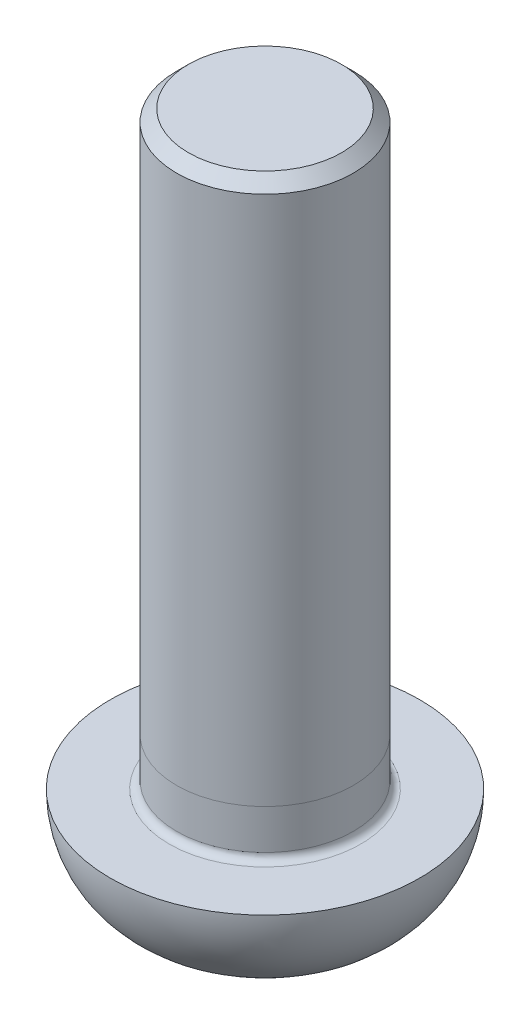
ISO-10303-21;
HEADER;
FILE_DESCRIPTION(('STEP AP214'),'2;1');
FILE_NAME('part.step','',(''),(''),'','','');
FILE_SCHEMA(('AUTOMOTIVE_DESIGN { 1 0 10303 214 1 1 1 1 }'));
ENDSEC;
DATA;
#1=APPLICATION_CONTEXT('core data for automotive mechanical design processes');
#2=APPLICATION_PROTOCOL_DEFINITION('international standard','automotive_design',2000,#1);
#3=PRODUCT_CONTEXT('',#1,'mechanical');
#4=PRODUCT('Part','Part','',(#3));
#5=PRODUCT_RELATED_PRODUCT_CATEGORY('part','',(#4));
#6=PRODUCT_DEFINITION_FORMATION('','',#4);
#7=PRODUCT_DEFINITION_CONTEXT('part definition',#1,'design');
#8=PRODUCT_DEFINITION('design','',#6,#7);
#9=PRODUCT_DEFINITION_SHAPE('','',#8);
#10=(LENGTH_UNIT() NAMED_UNIT(*) SI_UNIT(.MILLI.,.METRE.));
#11=(NAMED_UNIT(*) PLANE_ANGLE_UNIT() SI_UNIT($,.RADIAN.));
#12=(NAMED_UNIT(*) SI_UNIT($,.STERADIAN.) SOLID_ANGLE_UNIT());
#13=UNCERTAINTY_MEASURE_WITH_UNIT(LENGTH_MEASURE(1.E-05),#10,'distance_accuracy_value','');
#14=(GEOMETRIC_REPRESENTATION_CONTEXT(3) GLOBAL_UNCERTAINTY_ASSIGNED_CONTEXT((#13)) GLOBAL_UNIT_ASSIGNED_CONTEXT((#10,
#11,#12)) REPRESENTATION_CONTEXT('',''));
#15=CARTESIAN_POINT('',(0.,0.,0.));
#16=DIRECTION('',(0.,0.,1.));
#17=DIRECTION('',(1.,0.,0.));
#18=AXIS2_PLACEMENT_3D('',#15,#16,#17);
#19=CARTESIAN_POINT('',(0.,0.,0.));
#20=DIRECTION('',(0.,1.,0.));
#21=DIRECTION('',(0.,0.,1.));
#22=AXIS2_PLACEMENT_3D('',#19,#20,#21);
#23=CYLINDRICAL_SURFACE('',#22,3.);
#24=CARTESIAN_POINT('',(0.,19.6,0.));
#25=DIRECTION('',(0.,1.,0.));
#26=DIRECTION('',(0.,0.,1.));
#27=AXIS2_PLACEMENT_3D('',#24,#25,#26);
#28=CIRCLE('',#27,3.);
#29=CARTESIAN_POINT('',(0.,19.6,3.));
#30=VERTEX_POINT('',#29);
#31=EDGE_CURVE('E28',#30,#30,#28,.F.);
#32=ORIENTED_EDGE('',*,*,#31,.T.);
#33=EDGE_LOOP('',(#32));
#34=FACE_BOUND('',#33,.T.);
#35=CARTESIAN_POINT('',(0.,1.6,0.));
#36=DIRECTION('',(0.,1.,0.));
#37=DIRECTION('',(0.,0.,1.));
#38=AXIS2_PLACEMENT_3D('',#35,#36,#37);
#39=CIRCLE('',#38,3.);
#40=CARTESIAN_POINT('',(0.,1.6,3.));
#41=VERTEX_POINT('',#40);
#42=EDGE_CURVE('E11',#41,#41,#39,.T.);
#43=ORIENTED_EDGE('',*,*,#42,.T.);
#44=EDGE_LOOP('',(#43));
#45=FACE_BOUND('',#44,.T.);
#46=ADVANCED_FACE('F18',(#34,#45),#23,.T.);
#47=ORIENTED_EDGE('',*,*,#42,.F.);
#48=EDGE_LOOP('',(#47));
#49=FACE_BOUND('',#48,.T.);
#50=CARTESIAN_POINT('',(0.,0.25,0.));
#51=DIRECTION('',(0.,1.,0.));
#52=DIRECTION('',(0.,0.,1.));
#53=AXIS2_PLACEMENT_3D('',#50,#51,#52);
#54=CIRCLE('',#53,3.);
#55=CARTESIAN_POINT('',(0.,0.25,3.));
#56=VERTEX_POINT('',#55);
#57=EDGE_CURVE('E280',#56,#56,#54,.T.);
#58=ORIENTED_EDGE('',*,*,#57,.T.);
#59=EDGE_LOOP('',(#58));
#60=FACE_BOUND('',#59,.T.);
#61=ADVANCED_FACE('F192',(#49,#60),#23,.T.);
#62=CARTESIAN_POINT('',(5.25,0.,0.));
#63=DIRECTION('',(0.,1.,0.));
#64=DIRECTION('',(0.,0.,1.));
#65=AXIS2_PLACEMENT_3D('',#62,#63,#64);
#66=PLANE('',#65);
#67=CARTESIAN_POINT('',(0.,0.,0.));
#68=DIRECTION('',(0.,1.,0.));
#69=DIRECTION('',(0.,0.,1.));
#70=AXIS2_PLACEMENT_3D('',#67,#68,#69);
#71=CIRCLE('',#70,3.25);
#72=CARTESIAN_POINT('',(0.,0.,3.25));
#73=VERTEX_POINT('',#72);
#74=EDGE_CURVE('E277',#73,#73,#71,.F.);
#75=ORIENTED_EDGE('',*,*,#74,.T.);
#76=EDGE_LOOP('',(#75));
#77=FACE_BOUND('',#76,.T.);
#78=CARTESIAN_POINT('',(0.,0.,0.));
#79=DIRECTION('',(0.,1.,0.));
#80=DIRECTION('',(0.,0.,1.));
#81=AXIS2_PLACEMENT_3D('',#78,#79,#80);
#82=CIRCLE('',#81,5.25);
#83=CARTESIAN_POINT('',(0.,0.,5.25));
#84=VERTEX_POINT('',#83);
#85=EDGE_CURVE('E108',#84,#84,#82,.T.);
#86=ORIENTED_EDGE('',*,*,#85,.T.);
#87=EDGE_LOOP('',(#86));
#88=FACE_BOUND('',#87,.T.);
#89=ADVANCED_FACE('F199',(#77,#88),#66,.T.);
#90=CARTESIAN_POINT('',(0.,20.,0.));
#91=DIRECTION('',(0.,1.,0.));
#92=DIRECTION('',(0.,0.,1.));
#93=AXIS2_PLACEMENT_3D('',#90,#91,#92);
#94=PLANE('',#93);
#95=CARTESIAN_POINT('',(0.,20.,0.));
#96=DIRECTION('',(0.,1.,0.));
#97=DIRECTION('',(0.,0.,1.));
#98=AXIS2_PLACEMENT_3D('',#95,#96,#97);
#99=CIRCLE('',#98,2.6);
#100=CARTESIAN_POINT('',(0.,20.,2.6));
#101=VERTEX_POINT('',#100);
#102=EDGE_CURVE('E282',#101,#101,#99,.T.);
#103=ORIENTED_EDGE('',*,*,#102,.T.);
#104=EDGE_LOOP('',(#103));
#105=FACE_BOUND('',#104,.T.);
#106=ADVANCED_FACE('F227',(#105),#94,.T.);
#107=CARTESIAN_POINT('',(0.,0.25,0.));
#108=DIRECTION('',(0.,1.,0.));
#109=DIRECTION('',(0.,0.,1.));
#110=AXIS2_PLACEMENT_3D('',#107,#108,#109);
#111=TOROIDAL_SURFACE('',#110,3.25,0.25);
#112=ORIENTED_EDGE('',*,*,#74,.F.);
#113=EDGE_LOOP('',(#112));
#114=FACE_BOUND('',#113,.T.);
#115=ORIENTED_EDGE('',*,*,#57,.F.);
#116=EDGE_LOOP('',(#115));
#117=FACE_BOUND('',#116,.T.);
#118=ADVANCED_FACE('F265',(#114,#117),#111,.F.);
#119=CARTESIAN_POINT('',(0.,20.,0.));
#120=DIRECTION('',(0.,-1.,0.));
#121=DIRECTION('',(0.,0.,-1.));
#122=AXIS2_PLACEMENT_3D('',#119,#120,#121);
#123=CONICAL_SURFACE('',#122,2.6,0.785398163397448);
#124=ORIENTED_EDGE('',*,*,#31,.F.);
#125=EDGE_LOOP('',(#124));
#126=FACE_BOUND('',#125,.T.);
#127=ORIENTED_EDGE('',*,*,#102,.F.);
#128=EDGE_LOOP('',(#127));
#129=FACE_BOUND('',#128,.T.);
#130=ADVANCED_FACE('F21',(#126,#129),#123,.T.);
#131=CARTESIAN_POINT('',(0.,0.,0.));
#132=DIRECTION('',(0.,-1.,0.));
#133=DIRECTION('',(0.,0.,-1.));
#134=AXIS2_PLACEMENT_3D('',#131,#132,#133);
#135=DEGENERATE_TOROIDAL_SURFACE('',#134,1.67165208586472,3.57834791413527,.T.);
#136=ORIENTED_EDGE('',*,*,#85,.F.);
#137=EDGE_LOOP('',(#136));
#138=FACE_BOUND('',#137,.T.);
#139=CARTESIAN_POINT('',(0.,-3.3,0.));
#140=DIRECTION('',(0.,-1.,0.));
#141=DIRECTION('',(0.,0.,-1.));
#142=AXIS2_PLACEMENT_3D('',#139,#140,#141);
#143=CIRCLE('',#142,3.05533333333333);
#144=CARTESIAN_POINT('',(0.,-3.3,-3.05533333333333));
#145=VERTEX_POINT('',#144);
#146=EDGE_CURVE('E119',#145,#145,#143,.T.);
#147=ORIENTED_EDGE('',*,*,#146,.F.);
#148=EDGE_LOOP('',(#147));
#149=FACE_BOUND('',#148,.T.);
#150=ADVANCED_FACE('F143',(#138,#149),#135,.T.);
#151=CARTESIAN_POINT('',(0.,0.391673276442843,0.));
#152=DIRECTION('',(0.,-1.,0.));
#153=DIRECTION('',(0.,0.,-1.));
#154=AXIS2_PLACEMENT_3D('',#151,#152,#153);
#155=CONICAL_SURFACE('',#154,0.,1.0471975511966);
#156=CARTESIAN_POINT('',(0.,0.391673276442843,0.));
#157=VERTEX_POINT('',#156);
#158=VERTEX_LOOP('',#157);
#159=FACE_BOUND('',#158,.T.);
#160=CARTESIAN_POINT('',(-1.15458506832542,-0.94172672855691,2.0002));
#161=CARTESIAN_POINT('',(-1.20532911262018,-0.91241679803709,1.91230873709994));
#162=CARTESIAN_POINT('',(-1.2565111744778,-0.885760113916877,1.82365880552641));
#163=CARTESIAN_POINT('',(-1.3597616401932,-0.839229752957131,1.6448237530022));
#164=CARTESIAN_POINT('',(-1.41183187919145,-0.81937253831919,1.55463545349496));
#165=CARTESIAN_POINT('',(-1.51532701829184,-0.788460725959663,1.37537661423669));
#166=CARTESIAN_POINT('',(-1.56673599086579,-0.777200413534941,1.28633366177369));
#167=CARTESIAN_POINT('',(-1.66979593505374,-0.763755924531052,1.10782860221495));
#168=CARTESIAN_POINT('',(-1.72144653186531,-0.76156061688988,1.01836714429604));
#169=CARTESIAN_POINT('',(-1.81796535054794,-0.766118251267061,0.851191646451197));
#170=CARTESIAN_POINT('',(-1.86284799277603,-0.771752136623426,0.773452629734213));
#171=CARTESIAN_POINT('',(-1.95232085557725,-0.789611157197239,0.618481085463865));
#172=CARTESIAN_POINT('',(-1.99691076648955,-0.80184239795985,0.5412490942588));
#173=CARTESIAN_POINT('',(-2.08656822922817,-0.832420698804021,0.385957813517798));
#174=CARTESIAN_POINT('',(-2.13162442866767,-0.850897429002127,0.30791818689262));
#175=CARTESIAN_POINT('',(-2.221064675979,-0.892832780149267,0.153003134307866));
#176=CARTESIAN_POINT('',(-2.26544987045196,-0.916281542428724,0.0761257223768807));
#177=CARTESIAN_POINT('',(-2.30951654681234,-0.941726728556909,-0.000200000000000072));
#178=B_SPLINE_CURVE_WITH_KNOTS('',3,(#160,#161,#162,#163,#164,#165,#166,#167,#168,#169,#170,
#171,#172,#173,#174,#175,#176,#177),.UNSPECIFIED.,.F.,.F.,(4,2,2,2,2,2,2,2,4),(0.,
0.317031824695611,0.634825876346566,0.944753967652639,1.25430138000372,1.52387047293094,
1.79368946861028,2.06949491027634,2.34475850821472),.UNSPECIFIED.);
#179=CARTESIAN_POINT('',(-1.15470053837926,-0.941660056890493,2.));
#180=VERTEX_POINT('',#179);
#181=CARTESIAN_POINT('',(-2.3094010767585,-0.941660056890492,0.));
#182=VERTEX_POINT('',#181);
#183=EDGE_CURVE('E231',#180,#182,#178,.T.);
#184=ORIENTED_EDGE('',*,*,#183,.T.);
#185=CARTESIAN_POINT('',(-2.30951654681234,-0.941726728556909,0.000200000000000068));
#186=CARTESIAN_POINT('',(-2.25877250251757,-0.912416798037088,-0.0876912629000591));
#187=CARTESIAN_POINT('',(-2.20759044065995,-0.885760113916875,-0.17634119447359));
#188=CARTESIAN_POINT('',(-2.10433997494456,-0.839229752957128,-0.3551762469978));
#189=CARTESIAN_POINT('',(-2.0522697359463,-0.819372538319187,-0.445364546505035));
#190=CARTESIAN_POINT('',(-1.94877459684592,-0.78846072595966,-0.624623385763304));
#191=CARTESIAN_POINT('',(-1.89736562427197,-0.777200413534938,-0.713666338226302));
#192=CARTESIAN_POINT('',(-1.79430568008402,-0.76375592453105,-0.892171397785041));
#193=CARTESIAN_POINT('',(-1.74265508327244,-0.761560616889878,-0.981632855703956));
#194=CARTESIAN_POINT('',(-1.64613626458981,-0.766118251267059,-1.1488083535488));
#195=CARTESIAN_POINT('',(-1.60125362236172,-0.771752136623423,-1.22654737026578));
#196=CARTESIAN_POINT('',(-1.5117807595605,-0.789611157197235,-1.38151891453613));
#197=CARTESIAN_POINT('',(-1.46719084864821,-0.801842397959847,-1.4587509057412));
#198=CARTESIAN_POINT('',(-1.37753338590959,-0.832420698804018,-1.6140421864822));
#199=CARTESIAN_POINT('',(-1.33247718647008,-0.850897429002124,-1.69208181310738));
#200=CARTESIAN_POINT('',(-1.24303693915875,-0.892832780149265,-1.84699686569214));
#201=CARTESIAN_POINT('',(-1.19865174468579,-0.916281542428723,-1.92387427762312));
#202=CARTESIAN_POINT('',(-1.15458506832541,-0.94172672855691,-2.0002));
#203=B_SPLINE_CURVE_WITH_KNOTS('',3,(#185,#186,#187,#188,#189,#190,#191,#192,#193,#194,#195,
#196,#197,#198,#199,#200,#201,#202),.UNSPECIFIED.,.F.,.F.,(4,2,2,2,2,2,2,2,4),(0.,
0.31703182469561,0.634825876346564,0.944753967652636,1.25430138000371,1.52387047293094,
1.79368946861028,2.06949491027634,2.34475850821473),.UNSPECIFIED.);
#204=CARTESIAN_POINT('',(-1.15470053837925,-0.941660056890493,-2.));
#205=VERTEX_POINT('',#204);
#206=EDGE_CURVE('E210',#182,#205,#203,.T.);
#207=ORIENTED_EDGE('',*,*,#206,.T.);
#208=CARTESIAN_POINT('',(-3.97107242292986,-2.17538835040825,-2.));
#209=CARTESIAN_POINT('',(-3.87868247277526,-2.12775059746127,-2.));
#210=CARTESIAN_POINT('',(-3.7861588003778,-2.08037372958414,-2.));
#211=CARTESIAN_POINT('',(-3.60078450821548,-1.98626017948102,-2.00000000000001));
#212=CARTESIAN_POINT('',(-3.50793388259158,-1.93952350880157,-2.00000000000001));
#213=CARTESIAN_POINT('',(-3.22850900761148,-1.80030535880982,-2.));
#214=CARTESIAN_POINT('',(-3.04135761037277,-1.70896924768975,-2.));
#215=CARTESIAN_POINT('',(-2.75397555619272,-1.5731154540905,-2.));
#216=CARTESIAN_POINT('',(-2.65454530475032,-1.52690595800733,-2.));
#217=CARTESIAN_POINT('',(-2.45492785759602,-1.43615536855376,-2.));
#218=CARTESIAN_POINT('',(-2.3547406899451,-1.39161421369455,-2.));
#219=CARTESIAN_POINT('',(-2.15350213975009,-1.30470652650298,-2.));
#220=CARTESIAN_POINT('',(-2.05245137959688,-1.26233856057289,-2.));
#221=CARTESIAN_POINT('',(-1.84919030086332,-1.18039650371769,-2.));
#222=CARTESIAN_POINT('',(-1.74697972173689,-1.14082305558609,-2.));
#223=CARTESIAN_POINT('',(-1.52508206994959,-1.05946514421621,-2.));
#224=CARTESIAN_POINT('',(-1.40516322629618,-1.01830385306277,-2.));
#225=CARTESIAN_POINT('',(-1.16321218809007,-0.942832074454553,-2.));
#226=CARTESIAN_POINT('',(-1.04118108489843,-0.908518157540933,-2.));
#227=CARTESIAN_POINT('',(-0.797191699347654,-0.849762632395411,-2.));
#228=CARTESIAN_POINT('',(-0.675277439673617,-0.825143320410585,-2.));
#229=CARTESIAN_POINT('',(-0.42968597996561,-0.78740551194056,-2.));
#230=CARTESIAN_POINT('',(-0.306009864773069,-0.774280224898857,-2.));
#231=CARTESIAN_POINT('',(-0.0561948130021474,-0.761222818220792,-2.));
#232=CARTESIAN_POINT('',(0.0699543957642671,-0.761477523372083,-2.));
#233=CARTESIAN_POINT('',(0.321490472578919,-0.775609005131668,-2.));
#234=CARTESIAN_POINT('',(0.446877078128915,-0.789490231676833,-2.));
#235=CARTESIAN_POINT('',(0.698268076239721,-0.829339251040338,-2.));
#236=CARTESIAN_POINT('',(0.824232704616094,-0.855548309192251,-1.99999999999999));
#237=CARTESIAN_POINT('',(1.07382197335698,-0.917314019236256,-2.));
#238=CARTESIAN_POINT('',(1.19744582529425,-0.952873762658447,-2.));
#239=CARTESIAN_POINT('',(1.43877717975325,-1.02962266424125,-2.));
#240=CARTESIAN_POINT('',(1.55655051066925,-1.07060890554915,-2.));
#241=CARTESIAN_POINT('',(1.79038315988528,-1.15724391469459,-1.99999999999999));
#242=CARTESIAN_POINT('',(1.90644203337208,-1.20289386902531,-1.99999999999999));
#243=CARTESIAN_POINT('',(2.13727613898438,-1.29764227315016,-1.99999999999999));
#244=CARTESIAN_POINT('',(2.25204987258198,-1.3467443434052,-1.99999999999999));
#245=CARTESIAN_POINT('',(2.48048565996255,-1.44747310577301,-1.99999999999999));
#246=CARTESIAN_POINT('',(2.59414765093807,-1.499099939544,-1.99999999999999));
#247=CARTESIAN_POINT('',(2.81406706680889,-1.60122748447267,-1.99999999999999));
#248=CARTESIAN_POINT('',(2.92037405177845,-1.65162191070667,-1.99999999999999));
#249=CARTESIAN_POINT('',(3.1323563665145,-1.75372845058398,-1.99999999999999));
#250=CARTESIAN_POINT('',(3.23803167473215,-1.80544060886685,-1.99999999999999));
#251=CARTESIAN_POINT('',(3.44851064882037,-1.90972549113419,-1.99999999999999));
#252=CARTESIAN_POINT('',(3.55331605390046,-1.96229471304186,-1.99999999999999));
#253=CARTESIAN_POINT('',(3.7624942913087,-2.06826501338616,-1.99999999999999));
#254=CARTESIAN_POINT('',(3.86686716058578,-2.12166601883339,-1.99999999999999));
#255=CARTESIAN_POINT('',(3.97107242292986,-2.17538835040825,-2.));
#256=B_SPLINE_CURVE_WITH_KNOTS('',3,(#208,#209,#210,#211,#212,#213,#214,#215,#216,#217,#218,
#219,#220,#221,#222,#223,#224,#225,#226,#227,#228,#229,#230,#231,#232,#233,#234,#235,#236,#237,
#238,#239,#240,#241,#242,#243,#244,#245,#246,#247,#248,#249,#250,#251,#252,#253,#254,#255),
.UNSPECIFIED.,.F.,.F.,(4,2,2,2,2,2,2,2,2,2,2,2,2,2,2,2,2,2,2,2,2,2,2,4),(0.,0.311842723826934,
0.62369106463389,1.24838758455579,1.57730682351192,1.90621392778465,2.23490119378745,
2.56366381964157,2.94387628317646,3.32389783939494,3.69658721194995,4.06905625447051,
4.44672744508521,4.82452201071132,5.21003920255201,5.59568401496473,5.96965872681082,
6.34372881945369,6.71819725104189,7.09268671728378,7.44561614609446,7.79855754669429,
8.15030525169476,8.50202226264185),.UNSPECIFIED.);
#257=CARTESIAN_POINT('',(1.15470053837925,-0.941660056890493,-2.));
#258=VERTEX_POINT('',#257);
#259=EDGE_CURVE('E106',#205,#258,#256,.T.);
#260=ORIENTED_EDGE('',*,*,#259,.T.);
#261=CARTESIAN_POINT('',(1.15458506832542,-0.941726728556909,-2.0002));
#262=CARTESIAN_POINT('',(1.20532911262018,-0.912416798037089,-1.91230873709994));
#263=CARTESIAN_POINT('',(1.2565111744778,-0.885760113916877,-1.82365880552641));
#264=CARTESIAN_POINT('',(1.3597616401932,-0.839229752957131,-1.6448237530022));
#265=CARTESIAN_POINT('',(1.41183187919145,-0.819372538319189,-1.55463545349496));
#266=CARTESIAN_POINT('',(1.51532701829183,-0.788460725959662,-1.37537661423669));
#267=CARTESIAN_POINT('',(1.56673599086579,-0.777200413534941,-1.2863336617737));
#268=CARTESIAN_POINT('',(1.66979593505373,-0.763755924531052,-1.10782860221496));
#269=CARTESIAN_POINT('',(1.72144653186531,-0.761560616889879,-1.01836714429604));
#270=CARTESIAN_POINT('',(1.81796535054794,-0.76611825126706,-0.851191646451198));
#271=CARTESIAN_POINT('',(1.86284799277603,-0.771752136623425,-0.773452629734214));
#272=CARTESIAN_POINT('',(1.95232085557725,-0.789611157197238,-0.618481085463866));
#273=CARTESIAN_POINT('',(1.99691076648955,-0.801842397959849,-0.5412490942588));
#274=CARTESIAN_POINT('',(2.08656822922816,-0.83242069880402,-0.385957813517797));
#275=CARTESIAN_POINT('',(2.13162442866767,-0.850897429002126,-0.307918186892618));
#276=CARTESIAN_POINT('',(2.221064675979,-0.892832780149267,-0.153003134307863));
#277=CARTESIAN_POINT('',(2.26544987045196,-0.916281542428724,-0.0761257223768773));
#278=CARTESIAN_POINT('',(2.30951654681234,-0.941726728556909,0.000200000000003827));
#279=B_SPLINE_CURVE_WITH_KNOTS('',3,(#261,#262,#263,#264,#265,#266,#267,#268,#269,#270,#271,
#272,#273,#274,#275,#276,#277,#278),.UNSPECIFIED.,.F.,.F.,(4,2,2,2,2,2,2,2,4),(0.,
0.317031824695611,0.634825876346564,0.944753967652637,1.25430138000371,1.52387047293094,
1.79368946861028,2.06949491027634,2.34475850821473),.UNSPECIFIED.);
#280=CARTESIAN_POINT('',(2.3094010767585,-0.941660056890493,0.));
#281=VERTEX_POINT('',#280);
#282=EDGE_CURVE('E255',#258,#281,#279,.T.);
#283=ORIENTED_EDGE('',*,*,#282,.T.);
#284=CARTESIAN_POINT('',(2.30951654681234,-0.941726728556909,-0.000199999999996057));
#285=CARTESIAN_POINT('',(2.25877250251757,-0.912416798037088,0.0876912629000633));
#286=CARTESIAN_POINT('',(2.20759044065995,-0.885760113916875,0.176341194473594));
#287=CARTESIAN_POINT('',(2.10433997494456,-0.839229752957129,0.355176246997805));
#288=CARTESIAN_POINT('',(2.0522697359463,-0.819372538319187,0.445364546505039));
#289=CARTESIAN_POINT('',(1.94877459684592,-0.78846072595966,0.624623385763309));
#290=CARTESIAN_POINT('',(1.89736562427197,-0.777200413534938,0.713666338226308));
#291=CARTESIAN_POINT('',(1.79430568008402,-0.76375592453105,0.892171397785046));
#292=CARTESIAN_POINT('',(1.74265508327243,-0.761560616889878,0.98163285570396));
#293=CARTESIAN_POINT('',(1.64613626458981,-0.766118251267059,1.1488083535488));
#294=CARTESIAN_POINT('',(1.60125362236172,-0.771752136623423,1.22654737026579));
#295=CARTESIAN_POINT('',(1.5117807595605,-0.789611157197236,1.38151891453614));
#296=CARTESIAN_POINT('',(1.46719084864821,-0.801842397959848,1.4587509057412));
#297=CARTESIAN_POINT('',(1.37753338590959,-0.832420698804018,1.6140421864822));
#298=CARTESIAN_POINT('',(1.33247718647008,-0.850897429002125,1.69208181310738));
#299=CARTESIAN_POINT('',(1.24303693915875,-0.892832780149265,1.84699686569214));
#300=CARTESIAN_POINT('',(1.19865174468579,-0.916281542428723,1.92387427762312));
#301=CARTESIAN_POINT('',(1.15458506832541,-0.941726728556909,2.0002));
#302=B_SPLINE_CURVE_WITH_KNOTS('',3,(#284,#285,#286,#287,#288,#289,#290,#291,#292,#293,#294,
#295,#296,#297,#298,#299,#300,#301),.UNSPECIFIED.,.F.,.F.,(4,2,2,2,2,2,2,2,4),(0.,
0.317031824695611,0.634825876346565,0.944753967652638,1.25430138000371,1.52387047293094,
1.79368946861028,2.06949491027634,2.34475850821473),.UNSPECIFIED.);
#303=CARTESIAN_POINT('',(1.15470053837924,-0.941660056890492,2.));
#304=VERTEX_POINT('',#303);
#305=EDGE_CURVE('E249',#281,#304,#302,.T.);
#306=ORIENTED_EDGE('',*,*,#305,.T.);
#307=CARTESIAN_POINT('',(3.97107242292986,-2.17538835040825,2.));
#308=CARTESIAN_POINT('',(3.87868247277525,-2.12775059746126,2.));
#309=CARTESIAN_POINT('',(3.7861588003778,-2.08037372958414,2.00000000000001));
#310=CARTESIAN_POINT('',(3.60078450821547,-1.98626017948102,2.00000000000001));
#311=CARTESIAN_POINT('',(3.50793388259158,-1.93952350880157,2.00000000000001));
#312=CARTESIAN_POINT('',(3.22850900761148,-1.80030535880982,2.));
#313=CARTESIAN_POINT('',(3.04135761037276,-1.70896924768974,2.));
#314=CARTESIAN_POINT('',(2.75397555619272,-1.5731154540905,2.));
#315=CARTESIAN_POINT('',(2.65454530475031,-1.52690595800733,2.));
#316=CARTESIAN_POINT('',(2.45492785759602,-1.43615536855376,2.));
#317=CARTESIAN_POINT('',(2.35474068994509,-1.39161421369454,2.));
#318=CARTESIAN_POINT('',(2.15350213975008,-1.30470652650297,2.));
#319=CARTESIAN_POINT('',(2.05245137959687,-1.26233856057289,2.));
#320=CARTESIAN_POINT('',(1.84919030086332,-1.18039650371768,2.));
#321=CARTESIAN_POINT('',(1.74697972173688,-1.14082305558609,2.));
#322=CARTESIAN_POINT('',(1.52508206994959,-1.05946514421621,2.));
#323=CARTESIAN_POINT('',(1.40516322629617,-1.01830385306277,2.));
#324=CARTESIAN_POINT('',(1.16321218809006,-0.942832074454551,2.));
#325=CARTESIAN_POINT('',(1.04118108489842,-0.90851815754093,2.));
#326=CARTESIAN_POINT('',(0.797191699347647,-0.849762632395409,2.));
#327=CARTESIAN_POINT('',(0.675277439673609,-0.825143320410583,2.));
#328=CARTESIAN_POINT('',(0.429685979965601,-0.787405511940558,2.));
#329=CARTESIAN_POINT('',(0.30600986477306,-0.774280224898856,2.));
#330=CARTESIAN_POINT('',(0.0561948130021376,-0.761222818220792,2.));
#331=CARTESIAN_POINT('',(-0.0699543957642771,-0.761477523372083,2.));
#332=CARTESIAN_POINT('',(-0.32149047257893,-0.775609005131668,2.));
#333=CARTESIAN_POINT('',(-0.446877078128926,-0.789490231676834,2.));
#334=CARTESIAN_POINT('',(-0.698268076239732,-0.82933925104034,2.));
#335=CARTESIAN_POINT('',(-0.824232704616105,-0.855548309192252,1.99999999999999));
#336=CARTESIAN_POINT('',(-1.07382197335699,-0.917314019236258,2.));
#337=CARTESIAN_POINT('',(-1.19744582529427,-0.95287376265845,2.));
#338=CARTESIAN_POINT('',(-1.43877717975326,-1.02962266424125,2.));
#339=CARTESIAN_POINT('',(-1.55655051066926,-1.07060890554915,1.99999999999999));
#340=CARTESIAN_POINT('',(-1.79038315988529,-1.15724391469459,1.99999999999999));
#341=CARTESIAN_POINT('',(-1.90644203337209,-1.20289386902531,1.99999999999999));
#342=CARTESIAN_POINT('',(-2.13727613898438,-1.29764227315017,1.99999999999999));
#343=CARTESIAN_POINT('',(-2.25204987258199,-1.3467443434052,1.99999999999999));
#344=CARTESIAN_POINT('',(-2.48048565996256,-1.44747310577301,1.99999999999999));
#345=CARTESIAN_POINT('',(-2.59414765093807,-1.499099939544,1.99999999999999));
#346=CARTESIAN_POINT('',(-2.81406706680889,-1.60122748447267,1.99999999999999));
#347=CARTESIAN_POINT('',(-2.92037405177846,-1.65162191070667,1.99999999999999));
#348=CARTESIAN_POINT('',(-3.1323563665145,-1.75372845058398,1.99999999999999));
#349=CARTESIAN_POINT('',(-3.23803167473215,-1.80544060886684,1.99999999999999));
#350=CARTESIAN_POINT('',(-3.44851064882038,-1.90972549113419,1.99999999999999));
#351=CARTESIAN_POINT('',(-3.55331605390046,-1.96229471304186,1.99999999999999));
#352=CARTESIAN_POINT('',(-3.7624942913087,-2.06826501338616,1.99999999999999));
#353=CARTESIAN_POINT('',(-3.86686716058578,-2.12166601883338,1.99999999999999));
#354=CARTESIAN_POINT('',(-3.97107242292986,-2.17538835040825,2.));
#355=B_SPLINE_CURVE_WITH_KNOTS('',3,(#307,#308,#309,#310,#311,#312,#313,#314,#315,#316,#317,
#318,#319,#320,#321,#322,#323,#324,#325,#326,#327,#328,#329,#330,#331,#332,#333,#334,#335,#336,
#337,#338,#339,#340,#341,#342,#343,#344,#345,#346,#347,#348,#349,#350,#351,#352,#353,#354),
.UNSPECIFIED.,.F.,.F.,(4,2,2,2,2,2,2,2,2,2,2,2,2,2,2,2,2,2,2,2,2,2,2,4),(0.,0.311842723826934,
0.623691064633889,1.24838758455579,1.57730682351192,1.90621392778465,2.23490119378744,
2.56366381964157,2.94387628317646,3.32389783939494,3.69658721194995,4.06905625447051,
4.44672744508521,4.82452201071133,5.21003920255201,5.59568401496474,5.96965872681082,
6.34372881945369,6.71819725104189,7.09268671728378,7.44561614609446,7.79855754669429,
8.15030525169475,8.50202226264184),.UNSPECIFIED.);
#356=EDGE_CURVE('E241',#304,#180,#355,.T.);
#357=ORIENTED_EDGE('',*,*,#356,.T.);
#358=EDGE_LOOP('',(#184,#207,#260,#283,#306,#357));
#359=FACE_BOUND('',#358,.T.);
#360=ADVANCED_FACE('F176',(#159,#359),#155,.F.);
#361=CARTESIAN_POINT('',(-1.15470053837925,24.3295132059905,-2.));
#362=DIRECTION('',(0.,0.,-1.));
#363=DIRECTION('',(-1.,0.,0.));
#364=AXIS2_PLACEMENT_3D('',#361,#362,#363);
#365=PLANE('',#364);
#366=CARTESIAN_POINT('',(3.54576846416073,-3.77200034906827,-2.));
#367=CARTESIAN_POINT('',(3.46032331155691,-3.75206057830072,-1.99999999999999));
#368=CARTESIAN_POINT('',(3.37484047761441,-3.73228232054218,-1.99999999999999));
#369=CARTESIAN_POINT('',(3.20378355240315,-3.69311847013324,-1.99999999999999));
#370=CARTESIAN_POINT('',(3.11820945972395,-3.67373288364707,-1.99999999999999));
#371=CARTESIAN_POINT('',(2.86130062428642,-3.61626384835692,-1.99999999999999));
#372=CARTESIAN_POINT('',(2.68980910024909,-3.57887512354549,-1.99999999999999));
#373=CARTESIAN_POINT('',(2.34458511529228,-3.50643853365192,-1.99999999999999));
#374=CARTESIAN_POINT('',(2.1708470844132,-3.47141698135254,-1.99999999999999));
#375=CARTESIAN_POINT('',(1.82256095831907,-3.40547978469486,-1.99999999999999));
#376=CARTESIAN_POINT('',(1.64801278540453,-3.37456454295519,-1.99999999999999));
#377=CARTESIAN_POINT('',(1.30271990845848,-3.31969790886641,-1.99999999999999));
#378=CARTESIAN_POINT('',(1.13200256296387,-3.29557843402185,-2.));
#379=CARTESIAN_POINT('',(0.789571689000483,-3.25587323584062,-2.));
#380=CARTESIAN_POINT('',(0.6178584998347,-3.24028476073478,-2.));
#381=CARTESIAN_POINT('',(0.36019540394543,-3.22525401912313,-2.));
#382=CARTESIAN_POINT('',(0.274483715684513,-3.22163460627376,-2.));
#383=CARTESIAN_POINT('',(0.102984480205782,-3.21731952917178,-2.));
#384=CARTESIAN_POINT('',(0.0171969334570651,-3.21662384696397,-2.));
#385=CARTESIAN_POINT('',(-0.15435587366281,-3.21819853237707,-2.));
#386=CARTESIAN_POINT('',(-0.240121132206929,-3.22046909420923,-2.));
#387=CARTESIAN_POINT('',(-0.411526390365097,-3.22785312413437,-2.));
#388=CARTESIAN_POINT('',(-0.497166389972947,-3.23296659236802,-2.));
#389=CARTESIAN_POINT('',(-0.706478859815856,-3.24865578967162,-2.));
#390=CARTESIAN_POINT('',(-0.830044925850673,-3.26065132303124,-2.));
#391=CARTESIAN_POINT('',(-1.07664653209346,-3.28907898341361,-2.));
#392=CARTESIAN_POINT('',(-1.19968208520209,-3.30551100192753,-2.));
#393=CARTESIAN_POINT('',(-1.44564714901042,-3.34186148211041,-2.));
#394=CARTESIAN_POINT('',(-1.5685749476794,-3.36179135163048,-2.));
#395=CARTESIAN_POINT('',(-1.81398159923811,-3.40425123821713,-2.));
#396=CARTESIAN_POINT('',(-1.93646042849967,-3.42678139015956,-2.));
#397=CARTESIAN_POINT('',(-2.18362417007064,-3.47428425653496,-2.));
#398=CARTESIAN_POINT('',(-2.30830103623406,-3.49929851142906,-2.));
#399=CARTESIAN_POINT('',(-2.55733999903382,-3.55084664791934,-2.));
#400=CARTESIAN_POINT('',(-2.68170209177125,-3.57738054824321,-2.));
#401=CARTESIAN_POINT('',(-2.92946437432295,-3.6314395789905,-2.));
#402=CARTESIAN_POINT('',(-3.05286599737638,-3.65895817166457,-2.));
#403=CARTESIAN_POINT('',(-3.29945995688185,-3.71487849715073,-2.));
#404=CARTESIAN_POINT('',(-3.4226523077504,-3.74328016629155,-2.));
#405=CARTESIAN_POINT('',(-3.54576846416072,-3.77200034906825,-2.));
#406=B_SPLINE_CURVE_WITH_KNOTS('',3,(#366,#367,#368,#369,#370,#371,#372,#373,#374,#375,#376,
#377,#378,#379,#380,#381,#382,#383,#384,#385,#386,#387,#388,#389,#390,#391,#392,#393,#394,#395,
#396,#397,#398,#399,#400,#401,#402,#403,#404,#405),.UNSPECIFIED.,.F.,.F.,(4,2,2,2,2,2,2,2,2,2,2,
2,2,2,2,2,2,2,2,4),(0.,0.263222401305707,0.526448931537519,1.05299375162049,1.58466125538442,
2.11638085006353,2.63348257137836,3.15041739730247,3.40773776741521,3.66505655727231,
3.92239219561216,4.17972784668617,4.55206097335712,4.92438499422329,5.29794667206535,
5.67152773515151,6.05299963584967,6.434476238713,6.81377086422973,7.1930382051055),.UNSPECIFIED.);
#407=CARTESIAN_POINT('',(1.15470053837925,-3.3,-2.));
#408=VERTEX_POINT('',#407);
#409=CARTESIAN_POINT('',(-1.15470053837925,-3.3,-2.));
#410=VERTEX_POINT('',#409);
#411=EDGE_CURVE('E87',#408,#410,#406,.T.);
#412=ORIENTED_EDGE('',*,*,#411,.F.);
#413=DIRECTION('',(0.,-1.,0.));
#414=VECTOR('',#413,1.);
#415=CARTESIAN_POINT('',(1.15470053837925,24.3295132059905,-2.));
#416=LINE('',#415,#414);
#417=EDGE_CURVE('E109',#258,#408,#416,.T.);
#418=ORIENTED_EDGE('',*,*,#417,.F.);
#419=ORIENTED_EDGE('',*,*,#259,.F.);
#420=DIRECTION('',(0.,-1.,0.));
#421=VECTOR('',#420,1.);
#422=CARTESIAN_POINT('',(-1.15470053837925,24.3295132059905,-2.));
#423=LINE('',#422,#421);
#424=EDGE_CURVE('E99',#205,#410,#423,.T.);
#425=ORIENTED_EDGE('',*,*,#424,.T.);
#426=EDGE_LOOP('',(#412,#418,#419,#425));
#427=FACE_BOUND('',#426,.T.);
#428=ADVANCED_FACE('F104',(#427),#365,.F.);
#429=CARTESIAN_POINT('',(1.15470053837925,24.3295132059905,-2.));
#430=DIRECTION('',(0.86602540378444,0.,-0.5));
#431=DIRECTION('',(-0.5,0.,-0.86602540378444));
#432=AXIS2_PLACEMENT_3D('',#429,#430,#431);
#433=PLANE('',#432);
#434=CARTESIAN_POINT('',(2.30951654681234,-3.30003094242808,0.000200000000003903));
#435=CARTESIAN_POINT('',(2.26155517902373,-3.28717294728116,-0.0828715258103687));
#436=CARTESIAN_POINT('',(2.21350683851658,-3.27549990930549,-0.166093692788127));
#437=CARTESIAN_POINT('',(2.11724043254796,-3.25499135519067,-0.332831998987827));
#438=CARTESIAN_POINT('',(2.06902230613691,-3.24615699216786,-0.416348243777552));
#439=CARTESIAN_POINT('',(1.972708744238,-3.231841640157,-0.58316822644438));
#440=CARTESIAN_POINT('',(1.92461396034488,-3.22634357564339,-0.666470835726323));
#441=CARTESIAN_POINT('',(1.8283630443694,-3.21897122197136,-0.8331823124709));
#442=CARTESIAN_POINT('',(1.78020692596914,-3.21709623134525,-0.91659115623545));
#443=CARTESIAN_POINT('',(1.68389468916862,-3.21709623134525,-1.08340884376455));
#444=CARTESIAN_POINT('',(1.63573857076836,-3.21897122197136,-1.1668176875291));
#445=CARTESIAN_POINT('',(1.53948765479288,-3.22634357564339,-1.33352916427367));
#446=CARTESIAN_POINT('',(1.49139287089975,-3.231841640157,-1.41683177355562));
#447=CARTESIAN_POINT('',(1.39507930900085,-3.24615699216786,-1.58365175622245));
#448=CARTESIAN_POINT('',(1.3468611825898,-3.25499135519067,-1.66716800101217));
#449=CARTESIAN_POINT('',(1.25059477662118,-3.27549990930549,-1.83390630721187));
#450=CARTESIAN_POINT('',(1.20254643611403,-3.28717294728116,-1.91712847418963));
#451=CARTESIAN_POINT('',(1.15458506832542,-3.30003094242808,-2.0002));
#452=B_SPLINE_CURVE_WITH_KNOTS('',3,(#434,#435,#436,#437,#438,#439,#440,#441,#442,#443,#444,
#445,#446,#447,#448,#449,#450,#451),.UNSPECIFIED.,.F.,.F.,(4,2,2,2,2,2,2,2,4),(0.,
0.290357249044671,0.580832297293914,0.869807841095772,1.15872743038697,1.44764701967818,
1.73662256348004,2.02709761172928,2.31745486077395),.UNSPECIFIED.);
#453=CARTESIAN_POINT('',(2.30940107675851,-3.3,0.));
#454=VERTEX_POINT('',#453);
#455=EDGE_CURVE('E94',#454,#408,#452,.T.);
#456=ORIENTED_EDGE('',*,*,#455,.F.);
#457=DIRECTION('',(0.,-1.,0.));
#458=VECTOR('',#457,1.);
#459=CARTESIAN_POINT('',(2.3094010767585,24.3295132059905,0.));
#460=LINE('',#459,#458);
#461=EDGE_CURVE('E313',#281,#454,#460,.T.);
#462=ORIENTED_EDGE('',*,*,#461,.F.);
#463=ORIENTED_EDGE('',*,*,#282,.F.);
#464=ORIENTED_EDGE('',*,*,#417,.T.);
#465=EDGE_LOOP('',(#456,#462,#463,#464));
#466=FACE_BOUND('',#465,.T.);
#467=ADVANCED_FACE('F175',(#466),#433,.F.);
#468=CARTESIAN_POINT('',(2.3094010767585,24.3295132059905,0.));
#469=DIRECTION('',(0.866025403784437,0.,0.5));
#470=DIRECTION('',(0.5,0.,-0.866025403784438));
#471=AXIS2_PLACEMENT_3D('',#468,#469,#470);
#472=PLANE('',#471);
#473=CARTESIAN_POINT('',(1.15458506832541,-3.30003094242808,2.0002));
#474=CARTESIAN_POINT('',(1.20254643611402,-3.28717294728116,1.91712847418963));
#475=CARTESIAN_POINT('',(1.25059477662117,-3.27549990930549,1.83390630721187));
#476=CARTESIAN_POINT('',(1.34686118258979,-3.25499135519067,1.66716800101217));
#477=CARTESIAN_POINT('',(1.39507930900085,-3.24615699216786,1.58365175622245));
#478=CARTESIAN_POINT('',(1.49139287089975,-3.231841640157,1.41683177355562));
#479=CARTESIAN_POINT('',(1.53948765479288,-3.22634357564339,1.33352916427368));
#480=CARTESIAN_POINT('',(1.63573857076836,-3.21897122197136,1.1668176875291));
#481=CARTESIAN_POINT('',(1.68389468916862,-3.21709623134525,1.08340884376455));
#482=CARTESIAN_POINT('',(1.78020692596913,-3.21709623134525,0.916591156235453));
#483=CARTESIAN_POINT('',(1.82836304436939,-3.21897122197136,0.833182312470904));
#484=CARTESIAN_POINT('',(1.92461396034487,-3.22634357564339,0.666470835726327));
#485=CARTESIAN_POINT('',(1.972708744238,-3.231841640157,0.583168226444384));
#486=CARTESIAN_POINT('',(2.0690223061369,-3.24615699216786,0.416348243777556));
#487=CARTESIAN_POINT('',(2.11724043254796,-3.25499135519067,0.332831998987831));
#488=CARTESIAN_POINT('',(2.21350683851658,-3.27549990930549,0.166093692788132));
#489=CARTESIAN_POINT('',(2.26155517902373,-3.28717294728116,0.0828715258103743));
#490=CARTESIAN_POINT('',(2.30951654681234,-3.30003094242808,-0.00019999999999655));
#491=B_SPLINE_CURVE_WITH_KNOTS('',3,(#473,#474,#475,#476,#477,#478,#479,#480,#481,#482,#483,
#484,#485,#486,#487,#488,#489,#490),.UNSPECIFIED.,.F.,.F.,(4,2,2,2,2,2,2,2,4),(0.,
0.290357249044671,0.580832297293914,0.869807841095771,1.15872743038697,1.44764701967818,
1.73662256348003,2.02709761172928,2.31745486077395),.UNSPECIFIED.);
#492=CARTESIAN_POINT('',(1.15470053837925,-3.3,2.));
#493=VERTEX_POINT('',#492);
#494=EDGE_CURVE('E128',#493,#454,#491,.T.);
#495=ORIENTED_EDGE('',*,*,#494,.F.);
#496=DIRECTION('',(0.,-1.,0.));
#497=VECTOR('',#496,1.);
#498=CARTESIAN_POINT('',(1.15470053837924,24.3295132059905,2.));
#499=LINE('',#498,#497);
#500=EDGE_CURVE('E310',#304,#493,#499,.T.);
#501=ORIENTED_EDGE('',*,*,#500,.F.);
#502=ORIENTED_EDGE('',*,*,#305,.F.);
#503=ORIENTED_EDGE('',*,*,#461,.T.);
#504=EDGE_LOOP('',(#495,#501,#502,#503));
#505=FACE_BOUND('',#504,.T.);
#506=ADVANCED_FACE('F179',(#505),#472,.F.);
#507=CARTESIAN_POINT('',(1.15470053837924,24.3295132059905,2.));
#508=DIRECTION('',(0.,0.,1.));
#509=DIRECTION('',(1.,0.,0.));
#510=AXIS2_PLACEMENT_3D('',#507,#508,#509);
#511=PLANE('',#510);
#512=CARTESIAN_POINT('',(-3.54576846416073,-3.77200034906825,2.));
#513=CARTESIAN_POINT('',(-3.46032331155691,-3.7520605783007,1.99999999999999));
#514=CARTESIAN_POINT('',(-3.37484047761441,-3.73228232054217,1.99999999999999));
#515=CARTESIAN_POINT('',(-3.20378355240315,-3.69311847013323,1.99999999999999));
#516=CARTESIAN_POINT('',(-3.11820945972395,-3.67373288364706,1.99999999999999));
#517=CARTESIAN_POINT('',(-2.86130062428642,-3.61626384835691,1.99999999999999));
#518=CARTESIAN_POINT('',(-2.68980910024909,-3.57887512354548,1.99999999999999));
#519=CARTESIAN_POINT('',(-2.34458511529227,-3.50643853365191,1.99999999999999));
#520=CARTESIAN_POINT('',(-2.1708470844132,-3.47141698135253,1.99999999999999));
#521=CARTESIAN_POINT('',(-1.82256095831907,-3.40547978469485,1.99999999999999));
#522=CARTESIAN_POINT('',(-1.64801278540452,-3.37456454295518,1.99999999999999));
#523=CARTESIAN_POINT('',(-1.30271990845847,-3.3196979088664,1.99999999999999));
#524=CARTESIAN_POINT('',(-1.13200256296387,-3.29557843402184,1.99999999999999));
#525=CARTESIAN_POINT('',(-0.789571689000479,-3.25587323584062,2.));
#526=CARTESIAN_POINT('',(-0.617858499834696,-3.24028476073478,2.));
#527=CARTESIAN_POINT('',(-0.360195403945427,-3.22525401912313,2.));
#528=CARTESIAN_POINT('',(-0.274483715684509,-3.22163460627376,2.));
#529=CARTESIAN_POINT('',(-0.102984480205778,-3.21731952917178,2.));
#530=CARTESIAN_POINT('',(-0.0171969334570617,-3.21662384696397,2.));
#531=CARTESIAN_POINT('',(0.154355873662813,-3.21819853237707,2.));
#532=CARTESIAN_POINT('',(0.240121132206932,-3.22046909420923,2.));
#533=CARTESIAN_POINT('',(0.4115263903651,-3.22785312413437,2.));
#534=CARTESIAN_POINT('',(0.49716638997295,-3.23296659236802,2.));
#535=CARTESIAN_POINT('',(0.706478859815859,-3.24865578967162,2.));
#536=CARTESIAN_POINT('',(0.830044925850675,-3.26065132303124,2.));
#537=CARTESIAN_POINT('',(1.07664653209346,-3.28907898341361,2.));
#538=CARTESIAN_POINT('',(1.19968208520209,-3.30551100192753,2.));
#539=CARTESIAN_POINT('',(1.44564714901042,-3.34186148211042,2.));
#540=CARTESIAN_POINT('',(1.56857494767939,-3.36179135163049,2.));
#541=CARTESIAN_POINT('',(1.81398159923811,-3.40425123821714,2.));
#542=CARTESIAN_POINT('',(1.93646042849966,-3.42678139015956,2.));
#543=CARTESIAN_POINT('',(2.18362417007064,-3.47428425653496,2.));
#544=CARTESIAN_POINT('',(2.30830103623405,-3.49929851142906,2.));
#545=CARTESIAN_POINT('',(2.55733999903381,-3.55084664791935,2.));
#546=CARTESIAN_POINT('',(2.68170209177124,-3.57738054824322,2.));
#547=CARTESIAN_POINT('',(2.92946437432295,-3.63143957899051,2.));
#548=CARTESIAN_POINT('',(3.05286599737637,-3.65895817166458,2.00000000000001));
#549=CARTESIAN_POINT('',(3.29945995688184,-3.71487849715075,2.));
#550=CARTESIAN_POINT('',(3.42265230775039,-3.74328016629156,2.));
#551=CARTESIAN_POINT('',(3.54576846416072,-3.77200034906826,2.));
#552=B_SPLINE_CURVE_WITH_KNOTS('',3,(#512,#513,#514,#515,#516,#517,#518,#519,#520,#521,#522,
#523,#524,#525,#526,#527,#528,#529,#530,#531,#532,#533,#534,#535,#536,#537,#538,#539,#540,#541,
#542,#543,#544,#545,#546,#547,#548,#549,#550,#551),.UNSPECIFIED.,.F.,.F.,(4,2,2,2,2,2,2,2,2,2,2,
2,2,2,2,2,2,2,2,4),(0.,0.263222401305707,0.526448931537519,1.05299375162049,1.58466125538442,
2.11638085006353,2.63348257137836,3.15041739730247,3.40773776741521,3.66505655727231,
3.92239219561216,4.17972784668617,4.55206097335711,4.92438499422329,5.29794667206534,
5.67152773515151,6.05299963584966,6.43447623871299,6.81377086422972,7.19303820510548),.UNSPECIFIED.);
#553=CARTESIAN_POINT('',(-1.15470053837926,-3.3,2.));
#554=VERTEX_POINT('',#553);
#555=EDGE_CURVE('E81',#554,#493,#552,.T.);
#556=ORIENTED_EDGE('',*,*,#555,.F.);
#557=DIRECTION('',(0.,-1.,0.));
#558=VECTOR('',#557,1.);
#559=CARTESIAN_POINT('',(-1.15470053837926,24.3295132059905,2.));
#560=LINE('',#559,#558);
#561=EDGE_CURVE('E42',#180,#554,#560,.T.);
#562=ORIENTED_EDGE('',*,*,#561,.F.);
#563=ORIENTED_EDGE('',*,*,#356,.F.);
#564=ORIENTED_EDGE('',*,*,#500,.T.);
#565=EDGE_LOOP('',(#556,#562,#563,#564));
#566=FACE_BOUND('',#565,.T.);
#567=ADVANCED_FACE('F135',(#566),#511,.F.);
#568=CARTESIAN_POINT('',(-1.15470053837926,24.3295132059905,2.));
#569=DIRECTION('',(-0.86602540378444,0.,0.5));
#570=DIRECTION('',(0.5,0.,0.86602540378444));
#571=AXIS2_PLACEMENT_3D('',#568,#569,#570);
#572=PLANE('',#571);
#573=CARTESIAN_POINT('',(-2.30951654681234,-3.30003094242807,-0.000199999999999873));
#574=CARTESIAN_POINT('',(-2.26155517902373,-3.28717294728115,0.0828715258103725));
#575=CARTESIAN_POINT('',(-2.21350683851658,-3.27549990930549,0.166093692788131));
#576=CARTESIAN_POINT('',(-2.11724043254796,-3.25499135519067,0.33283199898783));
#577=CARTESIAN_POINT('',(-2.06902230613691,-3.24615699216785,0.416348243777555));
#578=CARTESIAN_POINT('',(-1.97270874423801,-3.23184164015699,0.583168226444383));
#579=CARTESIAN_POINT('',(-1.92461396034488,-3.22634357564339,0.666470835726326));
#580=CARTESIAN_POINT('',(-1.8283630443694,-3.21897122197136,0.833182312470903));
#581=CARTESIAN_POINT('',(-1.78020692596914,-3.21709623134524,0.916591156235452));
#582=CARTESIAN_POINT('',(-1.68389468916862,-3.21709623134524,1.08340884376455));
#583=CARTESIAN_POINT('',(-1.63573857076836,-3.21897122197136,1.1668176875291));
#584=CARTESIAN_POINT('',(-1.53948765479288,-3.22634357564339,1.33352916427368));
#585=CARTESIAN_POINT('',(-1.49139287089976,-3.23184164015699,1.41683177355562));
#586=CARTESIAN_POINT('',(-1.39507930900085,-3.24615699216786,1.58365175622245));
#587=CARTESIAN_POINT('',(-1.3468611825898,-3.25499135519067,1.66716800101217));
#588=CARTESIAN_POINT('',(-1.25059477662118,-3.27549990930549,1.83390630721187));
#589=CARTESIAN_POINT('',(-1.20254643611403,-3.28717294728115,1.91712847418963));
#590=CARTESIAN_POINT('',(-1.15458506832542,-3.30003094242807,2.0002));
#591=B_SPLINE_CURVE_WITH_KNOTS('',3,(#573,#574,#575,#576,#577,#578,#579,#580,#581,#582,#583,
#584,#585,#586,#587,#588,#589,#590),.UNSPECIFIED.,.F.,.F.,(4,2,2,2,2,2,2,2,4),(0.,
0.29035724904467,0.580832297293913,0.86980784109577,1.15872743038697,1.44764701967817,
1.73662256348003,2.02709761172927,2.31745486077394),.UNSPECIFIED.);
#592=CARTESIAN_POINT('',(-2.3094010767585,-3.3,0.));
#593=VERTEX_POINT('',#592);
#594=EDGE_CURVE('E149',#593,#554,#591,.T.);
#595=ORIENTED_EDGE('',*,*,#594,.F.);
#596=DIRECTION('',(0.,-1.,0.));
#597=VECTOR('',#596,1.);
#598=CARTESIAN_POINT('',(-2.3094010767585,24.3295132059905,0.));
#599=LINE('',#598,#597);
#600=EDGE_CURVE('E102',#182,#593,#599,.T.);
#601=ORIENTED_EDGE('',*,*,#600,.F.);
#602=ORIENTED_EDGE('',*,*,#183,.F.);
#603=ORIENTED_EDGE('',*,*,#561,.T.);
#604=EDGE_LOOP('',(#595,#601,#602,#603));
#605=FACE_BOUND('',#604,.T.);
#606=ADVANCED_FACE('F188',(#605),#572,.F.);
#607=CARTESIAN_POINT('',(-2.3094010767585,24.3295132059905,0.));
#608=DIRECTION('',(-0.866025403784439,0.,-0.5));
#609=DIRECTION('',(-0.5,0.,0.866025403784438));
#610=AXIS2_PLACEMENT_3D('',#607,#608,#609);
#611=PLANE('',#610);
#612=CARTESIAN_POINT('',(-1.15458506832541,-3.30003094242807,-2.0002));
#613=CARTESIAN_POINT('',(-1.20254643611402,-3.28717294728115,-1.91712847418963));
#614=CARTESIAN_POINT('',(-1.25059477662117,-3.27549990930549,-1.83390630721187));
#615=CARTESIAN_POINT('',(-1.34686118258979,-3.25499135519067,-1.66716800101217));
#616=CARTESIAN_POINT('',(-1.39507930900085,-3.24615699216785,-1.58365175622245));
#617=CARTESIAN_POINT('',(-1.49139287089975,-3.23184164015699,-1.41683177355562));
#618=CARTESIAN_POINT('',(-1.53948765479288,-3.22634357564338,-1.33352916427368));
#619=CARTESIAN_POINT('',(-1.63573857076836,-3.21897122197135,-1.1668176875291));
#620=CARTESIAN_POINT('',(-1.68389468916862,-3.21709623134524,-1.08340884376455));
#621=CARTESIAN_POINT('',(-1.78020692596913,-3.21709623134524,-0.91659115623545));
#622=CARTESIAN_POINT('',(-1.82836304436939,-3.21897122197135,-0.833182312470901));
#623=CARTESIAN_POINT('',(-1.92461396034487,-3.22634357564338,-0.666470835726324));
#624=CARTESIAN_POINT('',(-1.972708744238,-3.23184164015699,-0.583168226444381));
#625=CARTESIAN_POINT('',(-2.0690223061369,-3.24615699216785,-0.416348243777553));
#626=CARTESIAN_POINT('',(-2.11724043254796,-3.25499135519066,-0.332831998987827));
#627=CARTESIAN_POINT('',(-2.21350683851658,-3.27549990930549,-0.166093692788128));
#628=CARTESIAN_POINT('',(-2.26155517902373,-3.28717294728115,-0.0828715258103703));
#629=CARTESIAN_POINT('',(-2.30951654681234,-3.30003094242807,0.00020000000000036));
#630=B_SPLINE_CURVE_WITH_KNOTS('',3,(#612,#613,#614,#615,#616,#617,#618,#619,#620,#621,#622,
#623,#624,#625,#626,#627,#628,#629),.UNSPECIFIED.,.F.,.F.,(4,2,2,2,2,2,2,2,4),(0.,
0.290357249044671,0.580832297293914,0.869807841095772,1.15872743038697,1.44764701967818,
1.73662256348003,2.02709761172928,2.31745486077395),.UNSPECIFIED.);
#631=EDGE_CURVE('E34',#410,#593,#630,.T.);
#632=ORIENTED_EDGE('',*,*,#631,.F.);
#633=ORIENTED_EDGE('',*,*,#424,.F.);
#634=ORIENTED_EDGE('',*,*,#206,.F.);
#635=ORIENTED_EDGE('',*,*,#600,.T.);
#636=EDGE_LOOP('',(#632,#633,#634,#635));
#637=FACE_BOUND('',#636,.T.);
#638=ADVANCED_FACE('F98',(#637),#611,.F.);
#639=CARTESIAN_POINT('',(0.,-2.68119784648299,0.));
#640=DIRECTION('',(0.,-1.,0.));
#641=DIRECTION('',(1.,0.,0.));
#642=AXIS2_PLACEMENT_3D('',#639,#640,#641);
#643=CONICAL_SURFACE('',#642,0.,1.30899693899575);
#644=ORIENTED_EDGE('',*,*,#411,.T.);
#645=CARTESIAN_POINT('',(0.,-3.3,0.));
#646=DIRECTION('',(0.,-1.,0.));
#647=DIRECTION('',(1.,0.,0.));
#648=AXIS2_PLACEMENT_3D('',#645,#646,#647);
#649=CIRCLE('',#648,2.30940107675851);
#650=EDGE_CURVE('E82',#410,#408,#649,.T.);
#651=ORIENTED_EDGE('',*,*,#650,.T.);
#652=EDGE_LOOP('',(#644,#651));
#653=FACE_BOUND('',#652,.T.);
#654=ADVANCED_FACE('F88',(#653),#643,.F.);
#655=ORIENTED_EDGE('',*,*,#455,.T.);
#656=EDGE_CURVE('E115',#408,#454,#649,.T.);
#657=ORIENTED_EDGE('',*,*,#656,.T.);
#658=EDGE_LOOP('',(#655,#657));
#659=FACE_BOUND('',#658,.T.);
#660=ADVANCED_FACE('F324',(#659),#643,.F.);
#661=ORIENTED_EDGE('',*,*,#494,.T.);
#662=EDGE_CURVE('E116',#454,#493,#649,.T.);
#663=ORIENTED_EDGE('',*,*,#662,.T.);
#664=EDGE_LOOP('',(#661,#663));
#665=FACE_BOUND('',#664,.T.);
#666=ADVANCED_FACE('F326',(#665),#643,.F.);
#667=ORIENTED_EDGE('',*,*,#555,.T.);
#668=EDGE_CURVE('E294',#493,#554,#649,.T.);
#669=ORIENTED_EDGE('',*,*,#668,.T.);
#670=EDGE_LOOP('',(#667,#669));
#671=FACE_BOUND('',#670,.T.);
#672=ADVANCED_FACE('F295',(#671),#643,.F.);
#673=ORIENTED_EDGE('',*,*,#594,.T.);
#674=EDGE_CURVE('E84',#554,#593,#649,.T.);
#675=ORIENTED_EDGE('',*,*,#674,.T.);
#676=EDGE_LOOP('',(#673,#675));
#677=FACE_BOUND('',#676,.T.);
#678=ADVANCED_FACE('F142',(#677),#643,.F.);
#679=ORIENTED_EDGE('',*,*,#631,.T.);
#680=EDGE_CURVE('E75',#593,#410,#649,.T.);
#681=ORIENTED_EDGE('',*,*,#680,.T.);
#682=EDGE_LOOP('',(#679,#681));
#683=FACE_BOUND('',#682,.T.);
#684=ADVANCED_FACE('F77',(#683),#643,.F.);
#685=CARTESIAN_POINT('',(0.,-3.3,0.));
#686=DIRECTION('',(0.,-1.,0.));
#687=DIRECTION('',(0.,0.,-1.));
#688=AXIS2_PLACEMENT_3D('',#685,#686,#687);
#689=PLANE('',#688);
#690=ORIENTED_EDGE('',*,*,#680,.F.);
#691=ORIENTED_EDGE('',*,*,#674,.F.);
#692=ORIENTED_EDGE('',*,*,#668,.F.);
#693=ORIENTED_EDGE('',*,*,#662,.F.);
#694=ORIENTED_EDGE('',*,*,#656,.F.);
#695=ORIENTED_EDGE('',*,*,#650,.F.);
#696=EDGE_LOOP('',(#690,#691,#692,#693,#694,#695));
#697=FACE_BOUND('',#696,.T.);
#698=ORIENTED_EDGE('',*,*,#146,.T.);
#699=EDGE_LOOP('',(#698));
#700=FACE_BOUND('',#699,.T.);
#701=ADVANCED_FACE('F112',(#697,#700),#689,.T.);
#702=CLOSED_SHELL('',(#46,#61,#89,#106,#118,#130,#150,#360,#428,#467,#506,#567,#606,#638,#654,
#660,#666,#672,#678,#684,#701));
#703=MANIFOLD_SOLID_BREP('B1',#702);
#704=ADVANCED_BREP_SHAPE_REPRESENTATION('',(#18,#703),#14);
#705=SHAPE_DEFINITION_REPRESENTATION(#9,#704);
ENDSEC;
END-ISO-10303-21;
